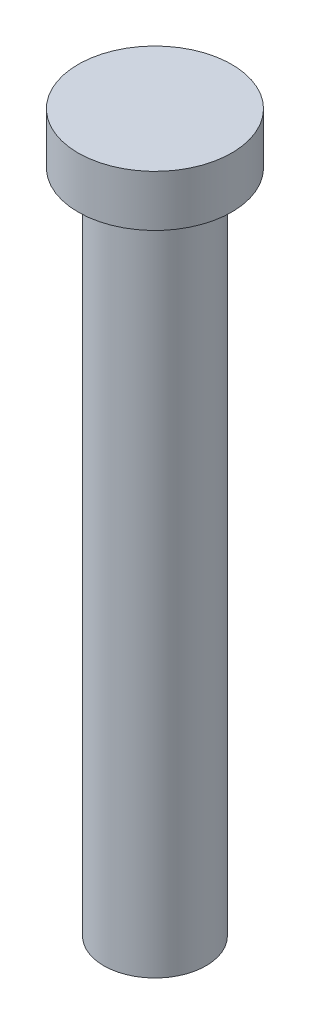
ISO-10303-21;
HEADER;
FILE_DESCRIPTION(('STEP AP214'),'2;1');
FILE_NAME('part.step','',(''),(''),'','','');
FILE_SCHEMA(('AUTOMOTIVE_DESIGN { 1 0 10303 214 1 1 1 1 }'));
ENDSEC;
DATA;
#1=APPLICATION_CONTEXT('core data for automotive mechanical design processes');
#2=APPLICATION_PROTOCOL_DEFINITION('international standard','automotive_design',2000,#1);
#3=PRODUCT_CONTEXT('',#1,'mechanical');
#4=PRODUCT('Part','Part','',(#3));
#5=PRODUCT_RELATED_PRODUCT_CATEGORY('part','',(#4));
#6=PRODUCT_DEFINITION_FORMATION('','',#4);
#7=PRODUCT_DEFINITION_CONTEXT('part definition',#1,'design');
#8=PRODUCT_DEFINITION('design','',#6,#7);
#9=PRODUCT_DEFINITION_SHAPE('','',#8);
#10=(LENGTH_UNIT() NAMED_UNIT(*) SI_UNIT(.MILLI.,.METRE.));
#11=(NAMED_UNIT(*) PLANE_ANGLE_UNIT() SI_UNIT($,.RADIAN.));
#12=(NAMED_UNIT(*) SI_UNIT($,.STERADIAN.) SOLID_ANGLE_UNIT());
#13=UNCERTAINTY_MEASURE_WITH_UNIT(LENGTH_MEASURE(1.E-05),#10,'distance_accuracy_value','');
#14=(GEOMETRIC_REPRESENTATION_CONTEXT(3) GLOBAL_UNCERTAINTY_ASSIGNED_CONTEXT((#13)) GLOBAL_UNIT_ASSIGNED_CONTEXT((#10,
#11,#12)) REPRESENTATION_CONTEXT('',''));
#15=CARTESIAN_POINT('',(0.,0.,0.));
#16=DIRECTION('',(0.,0.,1.));
#17=DIRECTION('',(1.,0.,0.));
#18=AXIS2_PLACEMENT_3D('',#15,#16,#17);
#19=CARTESIAN_POINT('',(0.,16.2461809726681,0.));
#20=DIRECTION('',(0.,-1.,0.));
#21=DIRECTION('',(0.,0.,-1.));
#22=AXIS2_PLACEMENT_3D('',#19,#20,#21);
#23=PLANE('',#22);
#24=CARTESIAN_POINT('',(0.,16.2461809726681,0.));
#25=DIRECTION('',(0.,1.,0.));
#26=DIRECTION('',(0.,0.,1.));
#27=AXIS2_PLACEMENT_3D('',#24,#25,#26);
#28=CIRCLE('',#27,3.);
#29=CARTESIAN_POINT('',(0.,16.2461809726681,3.));
#30=VERTEX_POINT('',#29);
#31=EDGE_CURVE('E10',#30,#30,#28,.T.);
#32=ORIENTED_EDGE('',*,*,#31,.T.);
#33=EDGE_LOOP('',(#32));
#34=FACE_BOUND('',#33,.T.);
#35=ADVANCED_FACE('F30',(#34),#23,.F.);
#36=CARTESIAN_POINT('',(0.,20.9904826455237,0.));
#37=DIRECTION('',(0.,1.,0.));
#38=DIRECTION('',(0.,0.,1.));
#39=AXIS2_PLACEMENT_3D('',#36,#37,#38);
#40=CYLINDRICAL_SURFACE('',#39,3.);
#41=ORIENTED_EDGE('',*,*,#31,.F.);
#42=EDGE_LOOP('',(#41));
#43=FACE_BOUND('',#42,.T.);
#44=CARTESIAN_POINT('',(0.,14.2461809726681,0.));
#45=DIRECTION('',(0.,1.,0.));
#46=DIRECTION('',(0.,0.,1.));
#47=AXIS2_PLACEMENT_3D('',#44,#45,#46);
#48=CIRCLE('',#47,3.);
#49=CARTESIAN_POINT('',(0.,14.2461809726681,3.));
#50=VERTEX_POINT('',#49);
#51=EDGE_CURVE('E36',#50,#50,#48,.T.);
#52=ORIENTED_EDGE('',*,*,#51,.T.);
#53=EDGE_LOOP('',(#52));
#54=FACE_BOUND('',#53,.T.);
#55=ADVANCED_FACE('F62',(#43,#54),#40,.T.);
#56=CARTESIAN_POINT('',(0.,14.2461809726681,-3.));
#57=DIRECTION('',(0.,1.,0.));
#58=DIRECTION('',(0.,0.,1.));
#59=AXIS2_PLACEMENT_3D('',#56,#57,#58);
#60=PLANE('',#59);
#61=ORIENTED_EDGE('',*,*,#51,.F.);
#62=EDGE_LOOP('',(#61));
#63=FACE_BOUND('',#62,.T.);
#64=CARTESIAN_POINT('',(0.,14.2461809726681,0.));
#65=DIRECTION('',(0.,1.,0.));
#66=DIRECTION('',(0.,0.,1.));
#67=AXIS2_PLACEMENT_3D('',#64,#65,#66);
#68=CIRCLE('',#67,1.99999999999999);
#69=CARTESIAN_POINT('',(0.,14.2461809726681,1.99999999999999));
#70=VERTEX_POINT('',#69);
#71=EDGE_CURVE('E40',#70,#70,#68,.T.);
#72=ORIENTED_EDGE('',*,*,#71,.T.);
#73=EDGE_LOOP('',(#72));
#74=FACE_BOUND('',#73,.T.);
#75=ADVANCED_FACE('F58',(#63,#74),#60,.F.);
#76=CARTESIAN_POINT('',(0.,20.9904826455237,0.));
#77=DIRECTION('',(0.,1.,0.));
#78=DIRECTION('',(0.,0.,1.));
#79=AXIS2_PLACEMENT_3D('',#76,#77,#78);
#80=CYLINDRICAL_SURFACE('',#79,2.);
#81=ORIENTED_EDGE('',*,*,#71,.F.);
#82=EDGE_LOOP('',(#81));
#83=FACE_BOUND('',#82,.T.);
#84=CARTESIAN_POINT('',(0.,-11.7538190273319,0.));
#85=DIRECTION('',(0.,1.,0.));
#86=DIRECTION('',(0.,0.,1.));
#87=AXIS2_PLACEMENT_3D('',#84,#85,#86);
#88=CIRCLE('',#87,2.);
#89=CARTESIAN_POINT('',(0.,-11.7538190273319,2.));
#90=VERTEX_POINT('',#89);
#91=EDGE_CURVE('E44',#90,#90,#88,.T.);
#92=ORIENTED_EDGE('',*,*,#91,.T.);
#93=EDGE_LOOP('',(#92));
#94=FACE_BOUND('',#93,.T.);
#95=ADVANCED_FACE('F50',(#83,#94),#80,.T.);
#96=CARTESIAN_POINT('',(0.,-11.7538190273319,-2.));
#97=DIRECTION('',(0.,1.,0.));
#98=DIRECTION('',(0.,0.,1.));
#99=AXIS2_PLACEMENT_3D('',#96,#97,#98);
#100=PLANE('',#99);
#101=ORIENTED_EDGE('',*,*,#91,.F.);
#102=EDGE_LOOP('',(#101));
#103=FACE_BOUND('',#102,.T.);
#104=ADVANCED_FACE('F52',(#103),#100,.F.);
#105=CLOSED_SHELL('',(#35,#55,#75,#95,#104));
#106=MANIFOLD_SOLID_BREP('B2',#105);
#107=ADVANCED_BREP_SHAPE_REPRESENTATION('',(#18,#106),#14);
#108=SHAPE_DEFINITION_REPRESENTATION(#9,#107);
ENDSEC;
END-ISO-10303-21;
